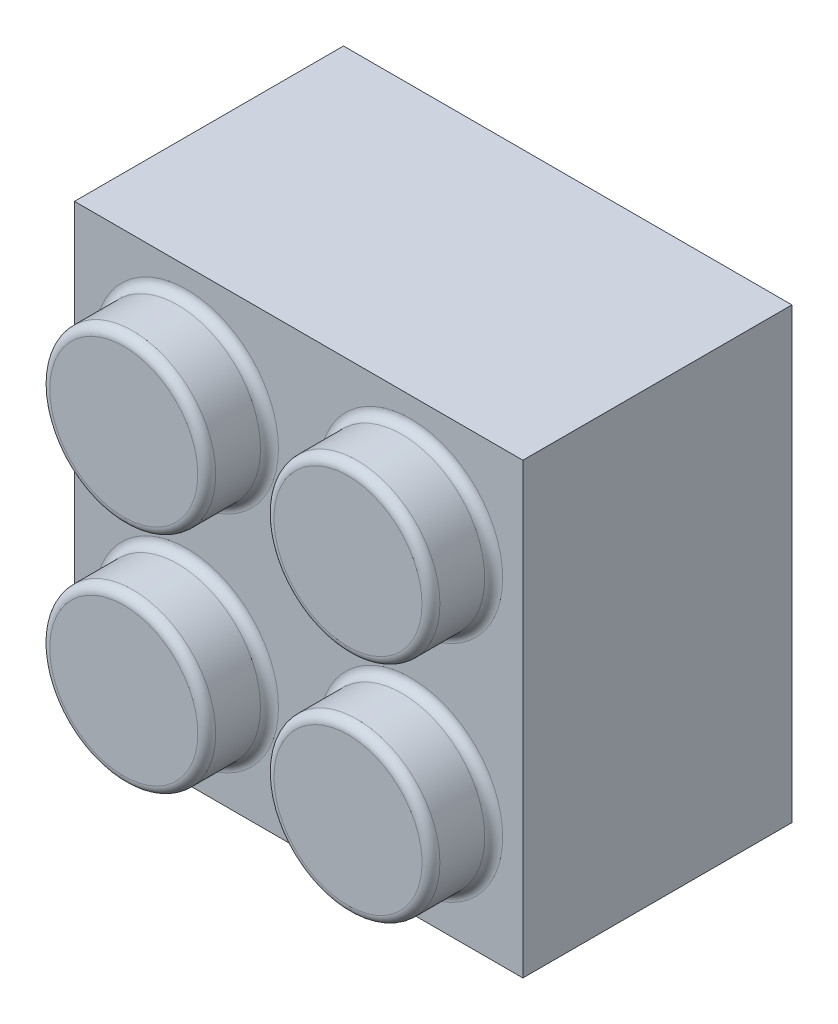
ISO-10303-21;
HEADER;
FILE_DESCRIPTION(('STEP AP214'),'2;1');
FILE_NAME('part.step','',(''),(''),'','','');
FILE_SCHEMA(('AUTOMOTIVE_DESIGN { 1 0 10303 214 1 1 1 1 }'));
ENDSEC;
DATA;
#1=APPLICATION_CONTEXT('core data for automotive mechanical design processes');
#2=APPLICATION_PROTOCOL_DEFINITION('international standard','automotive_design',2000,#1);
#3=PRODUCT_CONTEXT('',#1,'mechanical');
#4=PRODUCT('Part','Part','',(#3));
#5=PRODUCT_RELATED_PRODUCT_CATEGORY('part','',(#4));
#6=PRODUCT_DEFINITION_FORMATION('','',#4);
#7=PRODUCT_DEFINITION_CONTEXT('part definition',#1,'design');
#8=PRODUCT_DEFINITION('design','',#6,#7);
#9=PRODUCT_DEFINITION_SHAPE('','',#8);
#10=(LENGTH_UNIT() NAMED_UNIT(*) SI_UNIT(.MILLI.,.METRE.));
#11=(NAMED_UNIT(*) PLANE_ANGLE_UNIT() SI_UNIT($,.RADIAN.));
#12=(NAMED_UNIT(*) SI_UNIT($,.STERADIAN.) SOLID_ANGLE_UNIT());
#13=UNCERTAINTY_MEASURE_WITH_UNIT(LENGTH_MEASURE(1.E-05),#10,'distance_accuracy_value','');
#14=(GEOMETRIC_REPRESENTATION_CONTEXT(3) GLOBAL_UNCERTAINTY_ASSIGNED_CONTEXT((#13)) GLOBAL_UNIT_ASSIGNED_CONTEXT((#10,
#11,#12)) REPRESENTATION_CONTEXT('',''));
#15=CARTESIAN_POINT('',(0.,0.,0.));
#16=DIRECTION('',(0.,0.,1.));
#17=DIRECTION('',(1.,0.,0.));
#18=AXIS2_PLACEMENT_3D('',#15,#16,#17);
#19=CARTESIAN_POINT('',(0.,0.,0.));
#20=DIRECTION('',(0.,0.,1.));
#21=DIRECTION('',(1.,0.,0.));
#22=AXIS2_PLACEMENT_3D('',#19,#20,#21);
#23=PLANE('',#22);
#24=DIRECTION('',(1.,0.,0.));
#25=VECTOR('',#24,1.);
#26=CARTESIAN_POINT('',(-50.,-50.,0.));
#27=LINE('',#26,#25);
#28=CARTESIAN_POINT('',(-50.,-50.,0.));
#29=VERTEX_POINT('',#28);
#30=CARTESIAN_POINT('',(50.,-50.,0.));
#31=VERTEX_POINT('',#30);
#32=EDGE_CURVE('E166',#29,#31,#27,.T.);
#33=ORIENTED_EDGE('',*,*,#32,.F.);
#34=DIRECTION('',(0.,-1.,0.));
#35=VECTOR('',#34,1.);
#36=CARTESIAN_POINT('',(-50.,50.,0.));
#37=LINE('',#36,#35);
#38=CARTESIAN_POINT('',(-50.,50.,0.));
#39=VERTEX_POINT('',#38);
#40=EDGE_CURVE('E93',#39,#29,#37,.T.);
#41=ORIENTED_EDGE('',*,*,#40,.F.);
#42=DIRECTION('',(-1.,0.,0.));
#43=VECTOR('',#42,1.);
#44=CARTESIAN_POINT('',(50.,50.,0.));
#45=LINE('',#44,#43);
#46=CARTESIAN_POINT('',(50.,50.,0.));
#47=VERTEX_POINT('',#46);
#48=EDGE_CURVE('E181',#47,#39,#45,.T.);
#49=ORIENTED_EDGE('',*,*,#48,.F.);
#50=DIRECTION('',(0.,1.,0.));
#51=VECTOR('',#50,1.);
#52=CARTESIAN_POINT('',(50.,-50.,0.));
#53=LINE('',#52,#51);
#54=EDGE_CURVE('E179',#31,#47,#53,.T.);
#55=ORIENTED_EDGE('',*,*,#54,.F.);
#56=EDGE_LOOP('',(#33,#41,#49,#55));
#57=FACE_BOUND('',#56,.T.);
#58=DIRECTION('',(1.,0.,0.));
#59=VECTOR('',#58,1.);
#60=CARTESIAN_POINT('',(0.,-42.,0.));
#61=LINE('',#60,#59);
#62=CARTESIAN_POINT('',(-42.,-42.,0.));
#63=VERTEX_POINT('',#62);
#64=CARTESIAN_POINT('',(42.,-42.,0.));
#65=VERTEX_POINT('',#64);
#66=EDGE_CURVE('E63',#63,#65,#61,.T.);
#67=ORIENTED_EDGE('',*,*,#66,.T.);
#68=DIRECTION('',(0.,1.,0.));
#69=VECTOR('',#68,1.);
#70=CARTESIAN_POINT('',(42.,0.,0.));
#71=LINE('',#70,#69);
#72=CARTESIAN_POINT('',(42.,42.,0.));
#73=VERTEX_POINT('',#72);
#74=EDGE_CURVE('E146',#65,#73,#71,.T.);
#75=ORIENTED_EDGE('',*,*,#74,.T.);
#76=DIRECTION('',(-1.,0.,0.));
#77=VECTOR('',#76,1.);
#78=CARTESIAN_POINT('',(0.,42.,0.));
#79=LINE('',#78,#77);
#80=CARTESIAN_POINT('',(-42.,42.,0.));
#81=VERTEX_POINT('',#80);
#82=EDGE_CURVE('E159',#73,#81,#79,.T.);
#83=ORIENTED_EDGE('',*,*,#82,.T.);
#84=DIRECTION('',(0.,-1.,0.));
#85=VECTOR('',#84,1.);
#86=CARTESIAN_POINT('',(-42.,0.,0.));
#87=LINE('',#86,#85);
#88=EDGE_CURVE('E157',#81,#63,#87,.T.);
#89=ORIENTED_EDGE('',*,*,#88,.T.);
#90=EDGE_LOOP('',(#67,#75,#83,#89));
#91=FACE_BOUND('',#90,.T.);
#92=ADVANCED_FACE('F48',(#57,#91),#23,.F.);
#93=CARTESIAN_POINT('',(-50.,-50.,60.));
#94=DIRECTION('',(0.,1.,0.));
#95=DIRECTION('',(-1.,0.,0.));
#96=AXIS2_PLACEMENT_3D('',#93,#94,#95);
#97=PLANE('',#96);
#98=ORIENTED_EDGE('',*,*,#32,.T.);
#99=DIRECTION('',(0.,0.,-1.));
#100=VECTOR('',#99,1.);
#101=CARTESIAN_POINT('',(50.,-50.,60.));
#102=LINE('',#101,#100);
#103=CARTESIAN_POINT('',(50.,-50.,60.));
#104=VERTEX_POINT('',#103);
#105=EDGE_CURVE('E190',#104,#31,#102,.T.);
#106=ORIENTED_EDGE('',*,*,#105,.F.);
#107=DIRECTION('',(1.,0.,0.));
#108=VECTOR('',#107,1.);
#109=CARTESIAN_POINT('',(-50.,-50.,60.));
#110=LINE('',#109,#108);
#111=CARTESIAN_POINT('',(-50.,-50.,60.));
#112=VERTEX_POINT('',#111);
#113=EDGE_CURVE('E170',#112,#104,#110,.T.);
#114=ORIENTED_EDGE('',*,*,#113,.F.);
#115=DIRECTION('',(0.,0.,-1.));
#116=VECTOR('',#115,1.);
#117=CARTESIAN_POINT('',(-50.,-50.,60.));
#118=LINE('',#117,#116);
#119=EDGE_CURVE('E176',#112,#29,#118,.T.);
#120=ORIENTED_EDGE('',*,*,#119,.T.);
#121=EDGE_LOOP('',(#98,#106,#114,#120));
#122=FACE_BOUND('',#121,.T.);
#123=ADVANCED_FACE('F253',(#122),#97,.F.);
#124=CARTESIAN_POINT('',(50.,-50.,60.));
#125=DIRECTION('',(-1.,0.,0.));
#126=DIRECTION('',(0.,-1.,0.));
#127=AXIS2_PLACEMENT_3D('',#124,#125,#126);
#128=PLANE('',#127);
#129=ORIENTED_EDGE('',*,*,#54,.T.);
#130=DIRECTION('',(0.,0.,-1.));
#131=VECTOR('',#130,1.);
#132=CARTESIAN_POINT('',(50.,50.,60.));
#133=LINE('',#132,#131);
#134=CARTESIAN_POINT('',(50.,50.,60.));
#135=VERTEX_POINT('',#134);
#136=EDGE_CURVE('E187',#135,#47,#133,.T.);
#137=ORIENTED_EDGE('',*,*,#136,.F.);
#138=DIRECTION('',(0.,1.,0.));
#139=VECTOR('',#138,1.);
#140=CARTESIAN_POINT('',(50.,-50.,60.));
#141=LINE('',#140,#139);
#142=EDGE_CURVE('E101',#104,#135,#141,.T.);
#143=ORIENTED_EDGE('',*,*,#142,.F.);
#144=ORIENTED_EDGE('',*,*,#105,.T.);
#145=EDGE_LOOP('',(#129,#137,#143,#144));
#146=FACE_BOUND('',#145,.T.);
#147=ADVANCED_FACE('F260',(#146),#128,.F.);
#148=CARTESIAN_POINT('',(50.,50.,60.));
#149=DIRECTION('',(0.,-1.,0.));
#150=DIRECTION('',(1.,0.,0.));
#151=AXIS2_PLACEMENT_3D('',#148,#149,#150);
#152=PLANE('',#151);
#153=ORIENTED_EDGE('',*,*,#48,.T.);
#154=DIRECTION('',(0.,0.,-1.));
#155=VECTOR('',#154,1.);
#156=CARTESIAN_POINT('',(-50.,50.,60.));
#157=LINE('',#156,#155);
#158=CARTESIAN_POINT('',(-50.,50.,60.));
#159=VERTEX_POINT('',#158);
#160=EDGE_CURVE('E185',#159,#39,#157,.T.);
#161=ORIENTED_EDGE('',*,*,#160,.F.);
#162=DIRECTION('',(-1.,0.,0.));
#163=VECTOR('',#162,1.);
#164=CARTESIAN_POINT('',(50.,50.,60.));
#165=LINE('',#164,#163);
#166=EDGE_CURVE('E173',#135,#159,#165,.T.);
#167=ORIENTED_EDGE('',*,*,#166,.F.);
#168=ORIENTED_EDGE('',*,*,#136,.T.);
#169=EDGE_LOOP('',(#153,#161,#167,#168));
#170=FACE_BOUND('',#169,.T.);
#171=ADVANCED_FACE('F335',(#170),#152,.F.);
#172=CARTESIAN_POINT('',(-50.,50.,60.));
#173=DIRECTION('',(1.,0.,0.));
#174=DIRECTION('',(0.,1.,0.));
#175=AXIS2_PLACEMENT_3D('',#172,#173,#174);
#176=PLANE('',#175);
#177=ORIENTED_EDGE('',*,*,#40,.T.);
#178=ORIENTED_EDGE('',*,*,#119,.F.);
#179=DIRECTION('',(0.,-1.,0.));
#180=VECTOR('',#179,1.);
#181=CARTESIAN_POINT('',(-50.,50.,60.));
#182=LINE('',#181,#180);
#183=EDGE_CURVE('E72',#159,#112,#182,.T.);
#184=ORIENTED_EDGE('',*,*,#183,.F.);
#185=ORIENTED_EDGE('',*,*,#160,.T.);
#186=EDGE_LOOP('',(#177,#178,#184,#185));
#187=FACE_BOUND('',#186,.T.);
#188=ADVANCED_FACE('F330',(#187),#176,.F.);
#189=CARTESIAN_POINT('',(0.,0.,60.));
#190=DIRECTION('',(0.,0.,1.));
#191=DIRECTION('',(1.,0.,0.));
#192=AXIS2_PLACEMENT_3D('',#189,#190,#191);
#193=PLANE('',#192);
#194=CARTESIAN_POINT('',(25.,-25.,60.));
#195=DIRECTION('',(0.,0.,1.));
#196=DIRECTION('',(1.,0.,0.));
#197=AXIS2_PLACEMENT_3D('',#194,#195,#196);
#198=CIRCLE('',#197,20.5);
#199=CARTESIAN_POINT('',(45.5,-25.,60.));
#200=VERTEX_POINT('',#199);
#201=EDGE_CURVE('E207',#200,#200,#198,.F.);
#202=ORIENTED_EDGE('',*,*,#201,.T.);
#203=EDGE_LOOP('',(#202));
#204=FACE_BOUND('',#203,.T.);
#205=CARTESIAN_POINT('',(25.,25.,60.));
#206=DIRECTION('',(0.,0.,1.));
#207=DIRECTION('',(1.,0.,0.));
#208=AXIS2_PLACEMENT_3D('',#205,#206,#207);
#209=CIRCLE('',#208,20.5);
#210=CARTESIAN_POINT('',(45.5,25.,60.));
#211=VERTEX_POINT('',#210);
#212=EDGE_CURVE('E204',#211,#211,#209,.F.);
#213=ORIENTED_EDGE('',*,*,#212,.T.);
#214=EDGE_LOOP('',(#213));
#215=FACE_BOUND('',#214,.T.);
#216=CARTESIAN_POINT('',(-25.,25.,60.));
#217=DIRECTION('',(0.,0.,1.));
#218=DIRECTION('',(1.,0.,0.));
#219=AXIS2_PLACEMENT_3D('',#216,#217,#218);
#220=CIRCLE('',#219,20.5);
#221=CARTESIAN_POINT('',(-4.49999999999999,25.,60.));
#222=VERTEX_POINT('',#221);
#223=EDGE_CURVE('E201',#222,#222,#220,.F.);
#224=ORIENTED_EDGE('',*,*,#223,.T.);
#225=EDGE_LOOP('',(#224));
#226=FACE_BOUND('',#225,.T.);
#227=CARTESIAN_POINT('',(-25.,-25.,60.));
#228=DIRECTION('',(0.,0.,1.));
#229=DIRECTION('',(1.,0.,0.));
#230=AXIS2_PLACEMENT_3D('',#227,#228,#229);
#231=CIRCLE('',#230,20.5);
#232=CARTESIAN_POINT('',(-4.49999999999997,-25.,60.));
#233=VERTEX_POINT('',#232);
#234=EDGE_CURVE('E198',#233,#233,#231,.F.);
#235=ORIENTED_EDGE('',*,*,#234,.T.);
#236=EDGE_LOOP('',(#235));
#237=FACE_BOUND('',#236,.T.);
#238=ORIENTED_EDGE('',*,*,#113,.T.);
#239=ORIENTED_EDGE('',*,*,#142,.T.);
#240=ORIENTED_EDGE('',*,*,#166,.T.);
#241=ORIENTED_EDGE('',*,*,#183,.T.);
#242=EDGE_LOOP('',(#238,#239,#240,#241));
#243=FACE_BOUND('',#242,.T.);
#244=ADVANCED_FACE('F327',(#204,#215,#226,#237,#243),#193,.T.);
#245=CARTESIAN_POINT('',(25.,25.,74.));
#246=DIRECTION('',(0.,0.,-1.));
#247=DIRECTION('',(-1.,0.,0.));
#248=AXIS2_PLACEMENT_3D('',#245,#246,#247);
#249=CYLINDRICAL_SURFACE('',#248,18.5);
#250=CARTESIAN_POINT('',(25.,25.,62.));
#251=DIRECTION('',(0.,0.,1.));
#252=DIRECTION('',(1.,0.,0.));
#253=AXIS2_PLACEMENT_3D('',#250,#251,#252);
#254=CIRCLE('',#253,18.5);
#255=CARTESIAN_POINT('',(43.5,25.,62.));
#256=VERTEX_POINT('',#255);
#257=EDGE_CURVE('E216',#256,#256,#254,.T.);
#258=ORIENTED_EDGE('',*,*,#257,.T.);
#259=EDGE_LOOP('',(#258));
#260=FACE_BOUND('',#259,.T.);
#261=CARTESIAN_POINT('',(25.,25.,72.));
#262=DIRECTION('',(0.,0.,1.));
#263=DIRECTION('',(1.,0.,0.));
#264=AXIS2_PLACEMENT_3D('',#261,#262,#263);
#265=CIRCLE('',#264,18.5);
#266=CARTESIAN_POINT('',(43.5,25.,72.));
#267=VERTEX_POINT('',#266);
#268=EDGE_CURVE('E213',#267,#267,#265,.F.);
#269=ORIENTED_EDGE('',*,*,#268,.T.);
#270=EDGE_LOOP('',(#269));
#271=FACE_BOUND('',#270,.T.);
#272=ADVANCED_FACE('F324',(#260,#271),#249,.T.);
#273=CARTESIAN_POINT('',(25.,25.,74.));
#274=DIRECTION('',(0.,0.,1.));
#275=DIRECTION('',(1.,0.,0.));
#276=AXIS2_PLACEMENT_3D('',#273,#274,#275);
#277=PLANE('',#276);
#278=CARTESIAN_POINT('',(25.,25.,74.));
#279=DIRECTION('',(0.,0.,1.));
#280=DIRECTION('',(1.,0.,0.));
#281=AXIS2_PLACEMENT_3D('',#278,#279,#280);
#282=CIRCLE('',#281,16.5);
#283=CARTESIAN_POINT('',(41.5,25.,74.));
#284=VERTEX_POINT('',#283);
#285=EDGE_CURVE('E219',#284,#284,#282,.T.);
#286=ORIENTED_EDGE('',*,*,#285,.T.);
#287=EDGE_LOOP('',(#286));
#288=FACE_BOUND('',#287,.T.);
#289=ADVANCED_FACE('F320',(#288),#277,.T.);
#290=CARTESIAN_POINT('',(25.,-25.,74.));
#291=DIRECTION('',(0.,0.,-1.));
#292=DIRECTION('',(-1.,0.,0.));
#293=AXIS2_PLACEMENT_3D('',#290,#291,#292);
#294=CYLINDRICAL_SURFACE('',#293,18.5);
#295=CARTESIAN_POINT('',(25.,-25.,62.));
#296=DIRECTION('',(0.,0.,1.));
#297=DIRECTION('',(1.,0.,0.));
#298=AXIS2_PLACEMENT_3D('',#295,#296,#297);
#299=CIRCLE('',#298,18.5);
#300=CARTESIAN_POINT('',(43.5,-25.,62.));
#301=VERTEX_POINT('',#300);
#302=EDGE_CURVE('E195',#301,#301,#299,.T.);
#303=ORIENTED_EDGE('',*,*,#302,.T.);
#304=EDGE_LOOP('',(#303));
#305=FACE_BOUND('',#304,.T.);
#306=CARTESIAN_POINT('',(25.,-25.,72.));
#307=DIRECTION('',(0.,0.,-1.));
#308=DIRECTION('',(-1.,0.,0.));
#309=AXIS2_PLACEMENT_3D('',#306,#307,#308);
#310=CIRCLE('',#309,18.5);
#311=CARTESIAN_POINT('',(6.5,-25.,72.));
#312=VERTEX_POINT('',#311);
#313=EDGE_CURVE('E192',#312,#312,#310,.T.);
#314=ORIENTED_EDGE('',*,*,#313,.T.);
#315=EDGE_LOOP('',(#314));
#316=FACE_BOUND('',#315,.T.);
#317=ADVANCED_FACE('F316',(#305,#316),#294,.T.);
#318=CARTESIAN_POINT('',(25.,-25.,74.));
#319=DIRECTION('',(0.,0.,-1.));
#320=DIRECTION('',(-1.,0.,0.));
#321=AXIS2_PLACEMENT_3D('',#318,#319,#320);
#322=PLANE('',#321);
#323=CARTESIAN_POINT('',(25.,-25.,74.));
#324=DIRECTION('',(0.,0.,-1.));
#325=DIRECTION('',(-1.,0.,0.));
#326=AXIS2_PLACEMENT_3D('',#323,#324,#325);
#327=CIRCLE('',#326,16.5);
#328=CARTESIAN_POINT('',(8.5,-25.,74.));
#329=VERTEX_POINT('',#328);
#330=EDGE_CURVE('E210',#329,#329,#327,.F.);
#331=ORIENTED_EDGE('',*,*,#330,.T.);
#332=EDGE_LOOP('',(#331));
#333=FACE_BOUND('',#332,.T.);
#334=ADVANCED_FACE('F312',(#333),#322,.F.);
#335=CARTESIAN_POINT('',(-25.,25.,74.));
#336=DIRECTION('',(0.,0.,-1.));
#337=DIRECTION('',(-1.,0.,0.));
#338=AXIS2_PLACEMENT_3D('',#335,#336,#337);
#339=CYLINDRICAL_SURFACE('',#338,18.5);
#340=CARTESIAN_POINT('',(-25.,25.,62.));
#341=DIRECTION('',(0.,0.,1.));
#342=DIRECTION('',(1.,0.,0.));
#343=AXIS2_PLACEMENT_3D('',#340,#341,#342);
#344=CIRCLE('',#343,18.5);
#345=CARTESIAN_POINT('',(-6.49999999999998,25.,62.));
#346=VERTEX_POINT('',#345);
#347=EDGE_CURVE('E225',#346,#346,#344,.T.);
#348=ORIENTED_EDGE('',*,*,#347,.T.);
#349=EDGE_LOOP('',(#348));
#350=FACE_BOUND('',#349,.T.);
#351=CARTESIAN_POINT('',(-25.,25.,72.));
#352=DIRECTION('',(0.,0.,-1.));
#353=DIRECTION('',(-1.,0.,0.));
#354=AXIS2_PLACEMENT_3D('',#351,#352,#353);
#355=CIRCLE('',#354,18.5);
#356=CARTESIAN_POINT('',(-43.5,25.,72.));
#357=VERTEX_POINT('',#356);
#358=EDGE_CURVE('E222',#357,#357,#355,.T.);
#359=ORIENTED_EDGE('',*,*,#358,.T.);
#360=EDGE_LOOP('',(#359));
#361=FACE_BOUND('',#360,.T.);
#362=ADVANCED_FACE('F308',(#350,#361),#339,.T.);
#363=CARTESIAN_POINT('',(-25.,25.,74.));
#364=DIRECTION('',(0.,0.,-1.));
#365=DIRECTION('',(-1.,0.,0.));
#366=AXIS2_PLACEMENT_3D('',#363,#364,#365);
#367=PLANE('',#366);
#368=CARTESIAN_POINT('',(-25.,25.,74.));
#369=DIRECTION('',(0.,0.,-1.));
#370=DIRECTION('',(-1.,0.,0.));
#371=AXIS2_PLACEMENT_3D('',#368,#369,#370);
#372=CIRCLE('',#371,16.5);
#373=CARTESIAN_POINT('',(-41.5,25.,74.));
#374=VERTEX_POINT('',#373);
#375=EDGE_CURVE('E228',#374,#374,#372,.F.);
#376=ORIENTED_EDGE('',*,*,#375,.T.);
#377=EDGE_LOOP('',(#376));
#378=FACE_BOUND('',#377,.T.);
#379=ADVANCED_FACE('F305',(#378),#367,.F.);
#380=CARTESIAN_POINT('',(-25.,-25.,74.));
#381=DIRECTION('',(0.,0.,-1.));
#382=DIRECTION('',(-1.,0.,0.));
#383=AXIS2_PLACEMENT_3D('',#380,#381,#382);
#384=CYLINDRICAL_SURFACE('',#383,18.5);
#385=CARTESIAN_POINT('',(-25.,-25.,62.));
#386=DIRECTION('',(0.,0.,1.));
#387=DIRECTION('',(1.,0.,0.));
#388=AXIS2_PLACEMENT_3D('',#385,#386,#387);
#389=CIRCLE('',#388,18.5);
#390=CARTESIAN_POINT('',(-6.49999999999997,-25.,62.));
#391=VERTEX_POINT('',#390);
#392=EDGE_CURVE('E56',#391,#391,#389,.T.);
#393=ORIENTED_EDGE('',*,*,#392,.T.);
#394=EDGE_LOOP('',(#393));
#395=FACE_BOUND('',#394,.T.);
#396=CARTESIAN_POINT('',(-25.,-25.,72.));
#397=DIRECTION('',(0.,0.,1.));
#398=DIRECTION('',(1.,0.,0.));
#399=AXIS2_PLACEMENT_3D('',#396,#397,#398);
#400=CIRCLE('',#399,18.5);
#401=CARTESIAN_POINT('',(-6.49999999999997,-25.,72.));
#402=VERTEX_POINT('',#401);
#403=EDGE_CURVE('E231',#402,#402,#400,.F.);
#404=ORIENTED_EDGE('',*,*,#403,.T.);
#405=EDGE_LOOP('',(#404));
#406=FACE_BOUND('',#405,.T.);
#407=ADVANCED_FACE('F236',(#395,#406),#384,.T.);
#408=CARTESIAN_POINT('',(-25.,-25.,74.));
#409=DIRECTION('',(0.,0.,1.));
#410=DIRECTION('',(1.,0.,0.));
#411=AXIS2_PLACEMENT_3D('',#408,#409,#410);
#412=PLANE('',#411);
#413=CARTESIAN_POINT('',(-25.,-25.,74.));
#414=DIRECTION('',(0.,0.,1.));
#415=DIRECTION('',(1.,0.,0.));
#416=AXIS2_PLACEMENT_3D('',#413,#414,#415);
#417=CIRCLE('',#416,16.5);
#418=CARTESIAN_POINT('',(-8.49999999999997,-25.,74.));
#419=VERTEX_POINT('',#418);
#420=EDGE_CURVE('E12',#419,#419,#417,.T.);
#421=ORIENTED_EDGE('',*,*,#420,.T.);
#422=EDGE_LOOP('',(#421));
#423=FACE_BOUND('',#422,.T.);
#424=ADVANCED_FACE('F299',(#423),#412,.T.);
#425=CARTESIAN_POINT('',(0.,-42.,50.));
#426=DIRECTION('',(0.,1.,0.));
#427=DIRECTION('',(0.,0.,1.));
#428=AXIS2_PLACEMENT_3D('',#425,#426,#427);
#429=PLANE('',#428);
#430=ORIENTED_EDGE('',*,*,#66,.F.);
#431=DIRECTION('',(0.,0.,-1.));
#432=VECTOR('',#431,1.);
#433=CARTESIAN_POINT('',(-42.,-42.,50.));
#434=LINE('',#433,#432);
#435=CARTESIAN_POINT('',(-42.,-42.,50.));
#436=VERTEX_POINT('',#435);
#437=EDGE_CURVE('E128',#436,#63,#434,.T.);
#438=ORIENTED_EDGE('',*,*,#437,.F.);
#439=DIRECTION('',(1.,0.,0.));
#440=VECTOR('',#439,1.);
#441=CARTESIAN_POINT('',(0.,-42.,50.));
#442=LINE('',#441,#440);
#443=CARTESIAN_POINT('',(42.,-42.,50.));
#444=VERTEX_POINT('',#443);
#445=EDGE_CURVE('E135',#436,#444,#442,.T.);
#446=ORIENTED_EDGE('',*,*,#445,.T.);
#447=DIRECTION('',(0.,0.,-1.));
#448=VECTOR('',#447,1.);
#449=CARTESIAN_POINT('',(42.,-42.,50.));
#450=LINE('',#449,#448);
#451=EDGE_CURVE('E164',#444,#65,#450,.T.);
#452=ORIENTED_EDGE('',*,*,#451,.T.);
#453=EDGE_LOOP('',(#430,#438,#446,#452));
#454=FACE_BOUND('',#453,.T.);
#455=ADVANCED_FACE('F138',(#454),#429,.T.);
#456=CARTESIAN_POINT('',(42.,0.,50.));
#457=DIRECTION('',(-1.,0.,0.));
#458=DIRECTION('',(0.,0.,1.));
#459=AXIS2_PLACEMENT_3D('',#456,#457,#458);
#460=PLANE('',#459);
#461=ORIENTED_EDGE('',*,*,#74,.F.);
#462=ORIENTED_EDGE('',*,*,#451,.F.);
#463=DIRECTION('',(0.,1.,0.));
#464=VECTOR('',#463,1.);
#465=CARTESIAN_POINT('',(42.,0.,50.));
#466=LINE('',#465,#464);
#467=CARTESIAN_POINT('',(42.,42.,50.));
#468=VERTEX_POINT('',#467);
#469=EDGE_CURVE('E140',#444,#468,#466,.T.);
#470=ORIENTED_EDGE('',*,*,#469,.T.);
#471=DIRECTION('',(0.,0.,-1.));
#472=VECTOR('',#471,1.);
#473=CARTESIAN_POINT('',(42.,42.,50.));
#474=LINE('',#473,#472);
#475=EDGE_CURVE('E167',#468,#73,#474,.T.);
#476=ORIENTED_EDGE('',*,*,#475,.T.);
#477=EDGE_LOOP('',(#461,#462,#470,#476));
#478=FACE_BOUND('',#477,.T.);
#479=ADVANCED_FACE('F294',(#478),#460,.T.);
#480=CARTESIAN_POINT('',(0.,42.,50.));
#481=DIRECTION('',(0.,-1.,0.));
#482=DIRECTION('',(0.,0.,-1.));
#483=AXIS2_PLACEMENT_3D('',#480,#481,#482);
#484=PLANE('',#483);
#485=ORIENTED_EDGE('',*,*,#82,.F.);
#486=ORIENTED_EDGE('',*,*,#475,.F.);
#487=DIRECTION('',(-1.,0.,0.));
#488=VECTOR('',#487,1.);
#489=CARTESIAN_POINT('',(0.,42.,50.));
#490=LINE('',#489,#488);
#491=CARTESIAN_POINT('',(-42.,42.,50.));
#492=VERTEX_POINT('',#491);
#493=EDGE_CURVE('E134',#468,#492,#490,.T.);
#494=ORIENTED_EDGE('',*,*,#493,.T.);
#495=DIRECTION('',(0.,0.,-1.));
#496=VECTOR('',#495,1.);
#497=CARTESIAN_POINT('',(-42.,42.,50.));
#498=LINE('',#497,#496);
#499=EDGE_CURVE('E130',#492,#81,#498,.T.);
#500=ORIENTED_EDGE('',*,*,#499,.T.);
#501=EDGE_LOOP('',(#485,#486,#494,#500));
#502=FACE_BOUND('',#501,.T.);
#503=ADVANCED_FACE('F286',(#502),#484,.T.);
#504=CARTESIAN_POINT('',(0.,0.,50.));
#505=DIRECTION('',(0.,0.,-1.));
#506=DIRECTION('',(-1.,0.,0.));
#507=AXIS2_PLACEMENT_3D('',#504,#505,#506);
#508=CYLINDRICAL_SURFACE('',#507,18.5);
#509=CARTESIAN_POINT('',(0.,0.,50.));
#510=DIRECTION('',(0.,0.,-1.));
#511=DIRECTION('',(-1.,0.,0.));
#512=AXIS2_PLACEMENT_3D('',#509,#510,#511);
#513=CIRCLE('',#512,18.5);
#514=CARTESIAN_POINT('',(-18.5,0.,50.));
#515=VERTEX_POINT('',#514);
#516=EDGE_CURVE('E143',#515,#515,#513,.T.);
#517=ORIENTED_EDGE('',*,*,#516,.T.);
#518=EDGE_LOOP('',(#517));
#519=FACE_BOUND('',#518,.T.);
#520=CARTESIAN_POINT('',(0.,0.,0.));
#521=DIRECTION('',(0.,0.,-1.));
#522=DIRECTION('',(-1.,0.,0.));
#523=AXIS2_PLACEMENT_3D('',#520,#521,#522);
#524=CIRCLE('',#523,18.5);
#525=CARTESIAN_POINT('',(-18.5,0.,0.));
#526=VERTEX_POINT('',#525);
#527=EDGE_CURVE('E152',#526,#526,#524,.T.);
#528=ORIENTED_EDGE('',*,*,#527,.F.);
#529=EDGE_LOOP('',(#528));
#530=FACE_BOUND('',#529,.T.);
#531=ADVANCED_FACE('F284',(#519,#530),#508,.T.);
#532=CARTESIAN_POINT('',(-42.,0.,50.));
#533=DIRECTION('',(1.,0.,0.));
#534=DIRECTION('',(0.,0.,-1.));
#535=AXIS2_PLACEMENT_3D('',#532,#533,#534);
#536=PLANE('',#535);
#537=ORIENTED_EDGE('',*,*,#88,.F.);
#538=ORIENTED_EDGE('',*,*,#499,.F.);
#539=DIRECTION('',(0.,-1.,0.));
#540=VECTOR('',#539,1.);
#541=CARTESIAN_POINT('',(-42.,0.,50.));
#542=LINE('',#541,#540);
#543=EDGE_CURVE('E125',#492,#436,#542,.T.);
#544=ORIENTED_EDGE('',*,*,#543,.T.);
#545=ORIENTED_EDGE('',*,*,#437,.T.);
#546=EDGE_LOOP('',(#537,#538,#544,#545));
#547=FACE_BOUND('',#546,.T.);
#548=ADVANCED_FACE('F127',(#547),#536,.T.);
#549=CARTESIAN_POINT('',(0.,0.,50.));
#550=DIRECTION('',(0.,0.,-1.));
#551=DIRECTION('',(-1.,0.,0.));
#552=AXIS2_PLACEMENT_3D('',#549,#550,#551);
#553=PLANE('',#552);
#554=ORIENTED_EDGE('',*,*,#516,.F.);
#555=EDGE_LOOP('',(#554));
#556=FACE_BOUND('',#555,.T.);
#557=ORIENTED_EDGE('',*,*,#445,.F.);
#558=ORIENTED_EDGE('',*,*,#543,.F.);
#559=ORIENTED_EDGE('',*,*,#493,.F.);
#560=ORIENTED_EDGE('',*,*,#469,.F.);
#561=EDGE_LOOP('',(#557,#558,#559,#560));
#562=FACE_BOUND('',#561,.T.);
#563=ADVANCED_FACE('F142',(#556,#562),#553,.T.);
#564=CARTESIAN_POINT('',(0.,0.,0.));
#565=DIRECTION('',(0.,0.,-1.));
#566=DIRECTION('',(-1.,0.,0.));
#567=AXIS2_PLACEMENT_3D('',#564,#565,#566);
#568=CIRCLE('',#567,12.);
#569=CARTESIAN_POINT('',(-12.,0.,0.));
#570=VERTEX_POINT('',#569);
#571=EDGE_CURVE('E155',#570,#570,#568,.T.);
#572=ORIENTED_EDGE('',*,*,#571,.F.);
#573=EDGE_LOOP('',(#572));
#574=FACE_BOUND('',#573,.T.);
#575=ORIENTED_EDGE('',*,*,#527,.T.);
#576=EDGE_LOOP('',(#575));
#577=FACE_BOUND('',#576,.T.);
#578=ADVANCED_FACE('F256',(#574,#577),#23,.F.);
#579=CARTESIAN_POINT('',(0.,0.,50.));
#580=DIRECTION('',(0.,0.,-1.));
#581=DIRECTION('',(-1.,0.,0.));
#582=AXIS2_PLACEMENT_3D('',#579,#580,#581);
#583=CYLINDRICAL_SURFACE('',#582,12.);
#584=CARTESIAN_POINT('',(0.,0.,50.));
#585=DIRECTION('',(0.,0.,-1.));
#586=DIRECTION('',(-1.,0.,0.));
#587=AXIS2_PLACEMENT_3D('',#584,#585,#586);
#588=CIRCLE('',#587,12.);
#589=CARTESIAN_POINT('',(-12.,0.,50.));
#590=VERTEX_POINT('',#589);
#591=EDGE_CURVE('E564',#590,#590,#588,.T.);
#592=ORIENTED_EDGE('',*,*,#591,.F.);
#593=EDGE_LOOP('',(#592));
#594=FACE_BOUND('',#593,.T.);
#595=ORIENTED_EDGE('',*,*,#571,.T.);
#596=EDGE_LOOP('',(#595));
#597=FACE_BOUND('',#596,.T.);
#598=ADVANCED_FACE('F268',(#594,#597),#583,.F.);
#599=CARTESIAN_POINT('',(0.,0.,50.));
#600=DIRECTION('',(0.,0.,-1.));
#601=DIRECTION('',(-1.,0.,0.));
#602=AXIS2_PLACEMENT_3D('',#599,#600,#601);
#603=PLANE('',#602);
#604=ORIENTED_EDGE('',*,*,#591,.T.);
#605=EDGE_LOOP('',(#604));
#606=FACE_BOUND('',#605,.T.);
#607=ADVANCED_FACE('F274',(#606),#603,.T.);
#608=CARTESIAN_POINT('',(25.,-25.,62.));
#609=DIRECTION('',(0.,0.,1.));
#610=DIRECTION('',(1.,0.,0.));
#611=AXIS2_PLACEMENT_3D('',#608,#609,#610);
#612=TOROIDAL_SURFACE('',#611,20.5,2.);
#613=ORIENTED_EDGE('',*,*,#201,.F.);
#614=EDGE_LOOP('',(#613));
#615=FACE_BOUND('',#614,.T.);
#616=ORIENTED_EDGE('',*,*,#302,.F.);
#617=EDGE_LOOP('',(#616));
#618=FACE_BOUND('',#617,.T.);
#619=ADVANCED_FACE('F355',(#615,#618),#612,.F.);
#620=CARTESIAN_POINT('',(25.,-25.,72.));
#621=DIRECTION('',(0.,0.,-1.));
#622=DIRECTION('',(-1.,0.,0.));
#623=AXIS2_PLACEMENT_3D('',#620,#621,#622);
#624=TOROIDAL_SURFACE('',#623,16.5,2.);
#625=ORIENTED_EDGE('',*,*,#313,.F.);
#626=EDGE_LOOP('',(#625));
#627=FACE_BOUND('',#626,.T.);
#628=ORIENTED_EDGE('',*,*,#330,.F.);
#629=EDGE_LOOP('',(#628));
#630=FACE_BOUND('',#629,.T.);
#631=ADVANCED_FACE('F358',(#627,#630),#624,.T.);
#632=CARTESIAN_POINT('',(25.,25.,62.));
#633=DIRECTION('',(0.,0.,1.));
#634=DIRECTION('',(1.,0.,0.));
#635=AXIS2_PLACEMENT_3D('',#632,#633,#634);
#636=TOROIDAL_SURFACE('',#635,20.5,2.);
#637=ORIENTED_EDGE('',*,*,#212,.F.);
#638=EDGE_LOOP('',(#637));
#639=FACE_BOUND('',#638,.T.);
#640=ORIENTED_EDGE('',*,*,#257,.F.);
#641=EDGE_LOOP('',(#640));
#642=FACE_BOUND('',#641,.T.);
#643=ADVANCED_FACE('F362',(#639,#642),#636,.F.);
#644=CARTESIAN_POINT('',(25.,25.,72.));
#645=DIRECTION('',(0.,0.,1.));
#646=DIRECTION('',(1.,0.,0.));
#647=AXIS2_PLACEMENT_3D('',#644,#645,#646);
#648=TOROIDAL_SURFACE('',#647,16.5,2.);
#649=ORIENTED_EDGE('',*,*,#268,.F.);
#650=EDGE_LOOP('',(#649));
#651=FACE_BOUND('',#650,.T.);
#652=ORIENTED_EDGE('',*,*,#285,.F.);
#653=EDGE_LOOP('',(#652));
#654=FACE_BOUND('',#653,.T.);
#655=ADVANCED_FACE('F366',(#651,#654),#648,.T.);
#656=CARTESIAN_POINT('',(-25.,25.,62.));
#657=DIRECTION('',(0.,0.,1.));
#658=DIRECTION('',(1.,0.,0.));
#659=AXIS2_PLACEMENT_3D('',#656,#657,#658);
#660=TOROIDAL_SURFACE('',#659,20.5,2.);
#661=ORIENTED_EDGE('',*,*,#223,.F.);
#662=EDGE_LOOP('',(#661));
#663=FACE_BOUND('',#662,.T.);
#664=ORIENTED_EDGE('',*,*,#347,.F.);
#665=EDGE_LOOP('',(#664));
#666=FACE_BOUND('',#665,.T.);
#667=ADVANCED_FACE('F248',(#663,#666),#660,.F.);
#668=CARTESIAN_POINT('',(-25.,25.,72.));
#669=DIRECTION('',(0.,0.,-1.));
#670=DIRECTION('',(-1.,0.,0.));
#671=AXIS2_PLACEMENT_3D('',#668,#669,#670);
#672=TOROIDAL_SURFACE('',#671,16.5,2.);
#673=ORIENTED_EDGE('',*,*,#358,.F.);
#674=EDGE_LOOP('',(#673));
#675=FACE_BOUND('',#674,.T.);
#676=ORIENTED_EDGE('',*,*,#375,.F.);
#677=EDGE_LOOP('',(#676));
#678=FACE_BOUND('',#677,.T.);
#679=ADVANCED_FACE('F241',(#675,#678),#672,.T.);
#680=CARTESIAN_POINT('',(-25.,-25.,62.));
#681=DIRECTION('',(0.,0.,1.));
#682=DIRECTION('',(1.,0.,0.));
#683=AXIS2_PLACEMENT_3D('',#680,#681,#682);
#684=TOROIDAL_SURFACE('',#683,20.5,2.);
#685=ORIENTED_EDGE('',*,*,#234,.F.);
#686=EDGE_LOOP('',(#685));
#687=FACE_BOUND('',#686,.T.);
#688=ORIENTED_EDGE('',*,*,#392,.F.);
#689=EDGE_LOOP('',(#688));
#690=FACE_BOUND('',#689,.T.);
#691=ADVANCED_FACE('F239',(#687,#690),#684,.F.);
#692=CARTESIAN_POINT('',(-25.,-25.,72.));
#693=DIRECTION('',(0.,0.,1.));
#694=DIRECTION('',(1.,0.,0.));
#695=AXIS2_PLACEMENT_3D('',#692,#693,#694);
#696=TOROIDAL_SURFACE('',#695,16.5,2.);
#697=ORIENTED_EDGE('',*,*,#403,.F.);
#698=EDGE_LOOP('',(#697));
#699=FACE_BOUND('',#698,.T.);
#700=ORIENTED_EDGE('',*,*,#420,.F.);
#701=EDGE_LOOP('',(#700));
#702=FACE_BOUND('',#701,.T.);
#703=ADVANCED_FACE('F50',(#699,#702),#696,.T.);
#704=CLOSED_SHELL('',(#92,#123,#147,#171,#188,#244,#272,#289,#317,#334,#362,#379,#407,#424,#455,
#479,#503,#531,#548,#563,#578,#598,#607,#619,#631,#643,#655,#667,#679,#691,#703));
#705=MANIFOLD_SOLID_BREP('B2',#704);
#706=ADVANCED_BREP_SHAPE_REPRESENTATION('',(#18,#705),#14);
#707=SHAPE_DEFINITION_REPRESENTATION(#9,#706);
ENDSEC;
END-ISO-10303-21;
